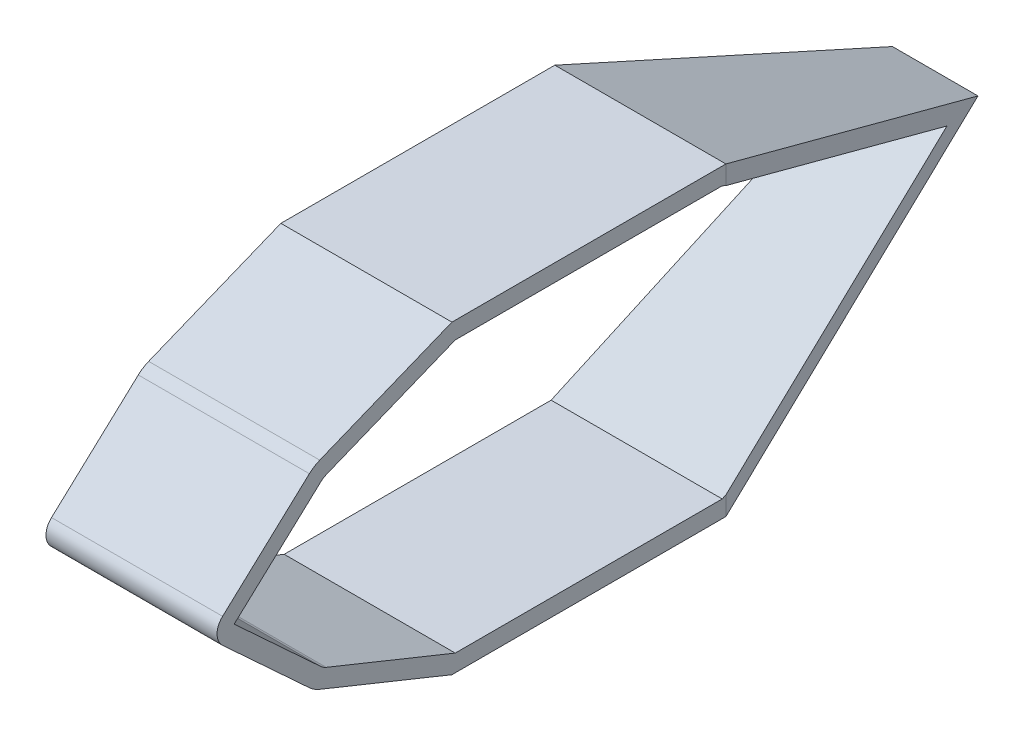
ISO-10303-21;
HEADER;
FILE_DESCRIPTION(('STEP AP214'),'2;1');
FILE_NAME('part.step','',(''),(''),'','','');
FILE_SCHEMA(('AUTOMOTIVE_DESIGN { 1 0 10303 214 1 1 1 1 }'));
ENDSEC;
DATA;
#1=APPLICATION_CONTEXT('core data for automotive mechanical design processes');
#2=APPLICATION_PROTOCOL_DEFINITION('international standard','automotive_design',2000,#1);
#3=PRODUCT_CONTEXT('',#1,'mechanical');
#4=PRODUCT('Part','Part','',(#3));
#5=PRODUCT_RELATED_PRODUCT_CATEGORY('part','',(#4));
#6=PRODUCT_DEFINITION_FORMATION('','',#4);
#7=PRODUCT_DEFINITION_CONTEXT('part definition',#1,'design');
#8=PRODUCT_DEFINITION('design','',#6,#7);
#9=PRODUCT_DEFINITION_SHAPE('','',#8);
#10=(LENGTH_UNIT() NAMED_UNIT(*) SI_UNIT(.MILLI.,.METRE.));
#11=(NAMED_UNIT(*) PLANE_ANGLE_UNIT() SI_UNIT($,.RADIAN.));
#12=(NAMED_UNIT(*) SI_UNIT($,.STERADIAN.) SOLID_ANGLE_UNIT());
#13=UNCERTAINTY_MEASURE_WITH_UNIT(LENGTH_MEASURE(1.E-05),#10,'distance_accuracy_value','');
#14=(GEOMETRIC_REPRESENTATION_CONTEXT(3) GLOBAL_UNCERTAINTY_ASSIGNED_CONTEXT((#13)) GLOBAL_UNIT_ASSIGNED_CONTEXT((#10,
#11,#12)) REPRESENTATION_CONTEXT('',''));
#15=CARTESIAN_POINT('',(0.,0.,0.));
#16=DIRECTION('',(0.,0.,1.));
#17=DIRECTION('',(1.,0.,0.));
#18=AXIS2_PLACEMENT_3D('',#15,#16,#17);
#19=CARTESIAN_POINT('',(0.,-19.7391785592261,74.9198203964593));
#20=DIRECTION('',(-1.,0.,0.));
#21=DIRECTION('',(0.,0.,1.));
#22=AXIS2_PLACEMENT_3D('',#19,#20,#21);
#23=PLANE('',#22);
#24=DIRECTION('',(0.,-0.37478188866065,-0.927113011413364));
#25=VECTOR('',#24,1.);
#26=CARTESIAN_POINT('',(0.,-44.6274996529894,40.0347666789892));
#27=LINE('',#26,#25);
#28=CARTESIAN_POINT('',(0.,-29.0103086733597,78.6676392830657));
#29=VERTEX_POINT('',#28);
#30=CARTESIAN_POINT('',(0.,-44.6274996529894,40.0347666789892));
#31=VERTEX_POINT('',#30);
#32=EDGE_CURVE('E275',#29,#31,#27,.T.);
#33=ORIENTED_EDGE('',*,*,#32,.F.);
#34=CARTESIAN_POINT('',(0.,-19.7391785592261,74.9198203964593));
#35=DIRECTION('',(1.,0.,0.));
#36=DIRECTION('',(0.,0.,1.));
#37=AXIS2_PLACEMENT_3D('',#34,#35,#36);
#38=CIRCLE('',#37,10.);
#39=CARTESIAN_POINT('',(0.,-27.0872588276389,81.7025717828041));
#40=VERTEX_POINT('',#39);
#41=EDGE_CURVE('E251',#40,#29,#38,.T.);
#42=ORIENTED_EDGE('',*,*,#41,.F.);
#43=DIRECTION('',(0.,-0.67827513863448,-0.734808026841281));
#44=VECTOR('',#43,1.);
#45=CARTESIAN_POINT('',(0.,-27.0872588276389,81.7025717828041));
#46=LINE('',#45,#44);
#47=CARTESIAN_POINT('',(0.,-3.67404013420349,107.067235840465));
#48=VERTEX_POINT('',#47);
#49=EDGE_CURVE('E254',#48,#40,#46,.T.);
#50=ORIENTED_EDGE('',*,*,#49,.F.);
#51=CARTESIAN_POINT('',(0.,2.94965179072665E-12,103.675860147292));
#52=DIRECTION('',(1.,0.,0.));
#53=DIRECTION('',(0.,0.,1.));
#54=AXIS2_PLACEMENT_3D('',#51,#52,#53);
#55=CIRCLE('',#54,5.);
#56=CARTESIAN_POINT('',(0.,3.67404013420982,107.067235840464));
#57=VERTEX_POINT('',#56);
#58=EDGE_CURVE('E260',#57,#48,#55,.T.);
#59=ORIENTED_EDGE('',*,*,#58,.F.);
#60=DIRECTION('',(0.,-0.678275138634384,0.73480802684137));
#61=VECTOR('',#60,1.);
#62=CARTESIAN_POINT('',(0.,27.087258827639,81.7025717828037));
#63=LINE('',#62,#61);
#64=CARTESIAN_POINT('',(0.,27.087258827639,81.7025717828037));
#65=VERTEX_POINT('',#64);
#66=EDGE_CURVE('E259',#65,#57,#63,.T.);
#67=ORIENTED_EDGE('',*,*,#66,.F.);
#68=CARTESIAN_POINT('',(0.,19.7391785592253,74.9198203964598));
#69=DIRECTION('',(1.,0.,0.));
#70=DIRECTION('',(0.,0.,1.));
#71=AXIS2_PLACEMENT_3D('',#68,#69,#70);
#72=CIRCLE('',#71,10.);
#73=CARTESIAN_POINT('',(0.,29.0103086733589,78.6676392830664));
#74=VERTEX_POINT('',#73);
#75=EDGE_CURVE('E261',#74,#65,#72,.T.);
#76=ORIENTED_EDGE('',*,*,#75,.F.);
#77=DIRECTION('',(0.,-0.374781888660659,0.92711301141336));
#78=VECTOR('',#77,1.);
#79=CARTESIAN_POINT('',(0.,44.6274996529891,40.0347666789897));
#80=LINE('',#79,#78);
#81=CARTESIAN_POINT('',(0.,44.6274996529891,40.0347666789897));
#82=VERTEX_POINT('',#81);
#83=EDGE_CURVE('E263',#82,#74,#80,.T.);
#84=ORIENTED_EDGE('',*,*,#83,.F.);
#85=DIRECTION('',(0.,0.,1.));
#86=VECTOR('',#85,1.);
#87=CARTESIAN_POINT('',(0.,44.6274996529891,-40.0347666789897));
#88=LINE('',#87,#86);
#89=CARTESIAN_POINT('',(0.,44.6274996529891,-40.0347666789897));
#90=VERTEX_POINT('',#89);
#91=EDGE_CURVE('E264',#90,#82,#88,.T.);
#92=ORIENTED_EDGE('',*,*,#91,.F.);
#93=DIRECTION('',(0.,0.412048239460073,0.911162031889968));
#94=VECTOR('',#93,1.);
#95=CARTESIAN_POINT('',(0.,44.6274996529891,-40.0347666789897));
#96=LINE('',#95,#94);
#97=CARTESIAN_POINT('',(0.,4.75842531189694E-13,-138.719530665043));
#98=VERTEX_POINT('',#97);
#99=EDGE_CURVE('E270',#98,#90,#96,.T.);
#100=ORIENTED_EDGE('',*,*,#99,.F.);
#101=DIRECTION('',(0.,0.412048239460081,-0.911162031889964));
#102=VECTOR('',#101,1.);
#103=CARTESIAN_POINT('',(0.,-44.6274996529894,-40.0347666789892));
#104=LINE('',#103,#102);
#105=CARTESIAN_POINT('',(0.,-44.6274996529894,-40.0347666789892));
#106=VERTEX_POINT('',#105);
#107=EDGE_CURVE('E267',#106,#98,#104,.T.);
#108=ORIENTED_EDGE('',*,*,#107,.F.);
#109=DIRECTION('',(0.,0.,-1.));
#110=VECTOR('',#109,1.);
#111=CARTESIAN_POINT('',(0.,-44.6274996529894,-40.0347666789892));
#112=LINE('',#111,#110);
#113=EDGE_CURVE('E221',#31,#106,#112,.T.);
#114=ORIENTED_EDGE('',*,*,#113,.F.);
#115=EDGE_LOOP('',(#33,#42,#50,#59,#67,#76,#84,#92,#100,#108,#114));
#116=FACE_BOUND('',#115,.T.);
#117=CARTESIAN_POINT('',(0.,-19.7391785592261,74.9198203964593));
#118=DIRECTION('',(-1.,0.,0.));
#119=DIRECTION('',(0.,0.,1.));
#120=AXIS2_PLACEMENT_3D('',#117,#118,#119);
#121=CIRCLE('',#120,5.);
#122=CARTESIAN_POINT('',(0.,-23.4132186934325,78.3111960896317));
#123=VERTEX_POINT('',#122);
#124=CARTESIAN_POINT('',(0.,-24.3747436162929,76.7937298397625));
#125=VERTEX_POINT('',#124);
#126=EDGE_CURVE('E309',#123,#125,#121,.F.);
#127=ORIENTED_EDGE('',*,*,#126,.T.);
#128=DIRECTION('',(0.,-0.37478188866065,-0.927113011413364));
#129=VECTOR('',#128,1.);
#130=CARTESIAN_POINT('',(0.,-24.3747436162929,76.7937298397625));
#131=LINE('',#130,#129);
#132=CARTESIAN_POINT('',(0.,-39.6274996529894,39.0623745918594));
#133=VERTEX_POINT('',#132);
#134=EDGE_CURVE('E209',#125,#133,#131,.T.);
#135=ORIENTED_EDGE('',*,*,#134,.T.);
#136=DIRECTION('',(0.,0.,-1.));
#137=VECTOR('',#136,1.);
#138=CARTESIAN_POINT('',(0.,-39.6274996529894,74.9198203964593));
#139=LINE('',#138,#137);
#140=CARTESIAN_POINT('',(0.,-39.6274996529894,-38.956762217346));
#141=VERTEX_POINT('',#140);
#142=EDGE_CURVE('E313',#133,#141,#139,.T.);
#143=ORIENTED_EDGE('',*,*,#142,.T.);
#144=DIRECTION('',(0.,0.412048239460081,-0.911162031889964));
#145=VECTOR('',#144,1.);
#146=CARTESIAN_POINT('',(0.,-79.0049187915131,48.1185017853678));
#147=LINE('',#146,#145);
#148=CARTESIAN_POINT('',(0.,4.23284633657849E-13,-126.585029116021));
#149=VERTEX_POINT('',#148);
#150=EDGE_CURVE('E314',#141,#149,#147,.T.);
#151=ORIENTED_EDGE('',*,*,#150,.T.);
#152=DIRECTION('',(0.,0.412048239460073,0.911162031889968));
#153=VECTOR('',#152,1.);
#154=CARTESIAN_POINT('',(0.,72.3021352112733,33.2966403589197));
#155=LINE('',#154,#153);
#156=CARTESIAN_POINT('',(0.,39.6274996529891,-38.9567622173465));
#157=VERTEX_POINT('',#156);
#158=EDGE_CURVE('E320',#149,#157,#155,.T.);
#159=ORIENTED_EDGE('',*,*,#158,.T.);
#160=DIRECTION('',(0.,0.,1.));
#161=VECTOR('',#160,1.);
#162=CARTESIAN_POINT('',(0.,39.6274996529891,74.9198203964593));
#163=LINE('',#162,#161);
#164=CARTESIAN_POINT('',(0.,39.6274996529891,39.0623745918598));
#165=VERTEX_POINT('',#164);
#166=EDGE_CURVE('E319',#157,#165,#163,.T.);
#167=ORIENTED_EDGE('',*,*,#166,.T.);
#168=DIRECTION('',(0.,-0.374781888660659,0.92711301141336));
#169=VECTOR('',#168,1.);
#170=CARTESIAN_POINT('',(0.,18.8295557764333,90.5110837264103));
#171=LINE('',#170,#169);
#172=CARTESIAN_POINT('',(0.,24.3747436162921,76.7937298397631));
#173=VERTEX_POINT('',#172);
#174=EDGE_CURVE('E323',#165,#173,#171,.T.);
#175=ORIENTED_EDGE('',*,*,#174,.T.);
#176=CARTESIAN_POINT('',(0.,19.7391785592253,74.9198203964598));
#177=DIRECTION('',(-1.,0.,0.));
#178=DIRECTION('',(0.,0.,1.));
#179=AXIS2_PLACEMENT_3D('',#176,#177,#178);
#180=CIRCLE('',#179,5.);
#181=CARTESIAN_POINT('',(0.,23.4132186934321,78.3111960896318));
#182=VERTEX_POINT('',#181);
#183=EDGE_CURVE('E326',#173,#182,#180,.F.);
#184=ORIENTED_EDGE('',*,*,#183,.T.);
#185=DIRECTION('',(0.,-0.678275138634384,0.73480802684137));
#186=VECTOR('',#185,1.);
#187=CARTESIAN_POINT('',(0.,5.25091769039682,97.9872888767114));
#188=LINE('',#187,#186);
#189=CARTESIAN_POINT('',(0.,2.9511542931211E-12,103.675860147292));
#190=VERTEX_POINT('',#189);
#191=EDGE_CURVE('E328',#182,#190,#188,.T.);
#192=ORIENTED_EDGE('',*,*,#191,.T.);
#193=DIRECTION('',(0.,-0.67827513863448,-0.734808026841281));
#194=VECTOR('',#193,1.);
#195=CARTESIAN_POINT('',(0.,-23.4132186934325,78.3111960896317));
#196=LINE('',#195,#194);
#197=EDGE_CURVE('E335',#190,#123,#196,.T.);
#198=ORIENTED_EDGE('',*,*,#197,.T.);
#199=EDGE_LOOP('',(#127,#135,#143,#151,#159,#167,#175,#184,#192,#198));
#200=FACE_BOUND('',#199,.T.);
#201=ADVANCED_FACE('F43',(#116,#200),#23,.T.);
#202=CARTESIAN_POINT('',(50.,-44.6274996529894,40.0347666789892));
#203=DIRECTION('',(0.,0.927113011413364,-0.37478188866065));
#204=DIRECTION('',(0.,0.37478188866065,0.927113011413364));
#205=AXIS2_PLACEMENT_3D('',#202,#203,#204);
#206=PLANE('',#205);
#207=ORIENTED_EDGE('',*,*,#32,.T.);
#208=DIRECTION('',(-1.,0.,0.));
#209=VECTOR('',#208,1.);
#210=CARTESIAN_POINT('',(50.,-44.6274996529894,40.0347666789892));
#211=LINE('',#210,#209);
#212=CARTESIAN_POINT('',(50.,-44.6274996529894,40.0347666789892));
#213=VERTEX_POINT('',#212);
#214=EDGE_CURVE('E51',#213,#31,#211,.T.);
#215=ORIENTED_EDGE('',*,*,#214,.F.);
#216=DIRECTION('',(0.,-0.37478188866065,-0.927113011413364));
#217=VECTOR('',#216,1.);
#218=CARTESIAN_POINT('',(50.,-44.6274996529894,40.0347666789892));
#219=LINE('',#218,#217);
#220=CARTESIAN_POINT('',(50.,-29.0103086733597,78.6676392830657));
#221=VERTEX_POINT('',#220);
#222=EDGE_CURVE('E220',#221,#213,#219,.T.);
#223=ORIENTED_EDGE('',*,*,#222,.F.);
#224=DIRECTION('',(-1.,0.,0.));
#225=VECTOR('',#224,1.);
#226=CARTESIAN_POINT('',(50.,-29.0103086733597,78.6676392830657));
#227=LINE('',#226,#225);
#228=EDGE_CURVE('E248',#221,#29,#227,.T.);
#229=ORIENTED_EDGE('',*,*,#228,.T.);
#230=EDGE_LOOP('',(#207,#215,#223,#229));
#231=FACE_BOUND('',#230,.T.);
#232=ADVANCED_FACE('F44',(#231),#206,.F.);
#233=CARTESIAN_POINT('',(50.,-44.6274996529894,-40.0347666789892));
#234=DIRECTION('',(0.,1.,0.));
#235=DIRECTION('',(0.,0.,1.));
#236=AXIS2_PLACEMENT_3D('',#233,#234,#235);
#237=PLANE('',#236);
#238=ORIENTED_EDGE('',*,*,#113,.T.);
#239=DIRECTION('',(-1.,0.,0.));
#240=VECTOR('',#239,1.);
#241=CARTESIAN_POINT('',(50.,-44.6274996529894,-40.0347666789892));
#242=LINE('',#241,#240);
#243=CARTESIAN_POINT('',(50.,-44.6274996529894,-40.0347666789897));
#244=VERTEX_POINT('',#243);
#245=EDGE_CURVE('E210',#244,#106,#242,.T.);
#246=ORIENTED_EDGE('',*,*,#245,.F.);
#247=DIRECTION('',(0.,0.,-1.));
#248=VECTOR('',#247,1.);
#249=CARTESIAN_POINT('',(50.,-44.6274996529894,-40.0347666789892));
#250=LINE('',#249,#248);
#251=EDGE_CURVE('E212',#213,#244,#250,.T.);
#252=ORIENTED_EDGE('',*,*,#251,.F.);
#253=ORIENTED_EDGE('',*,*,#214,.T.);
#254=EDGE_LOOP('',(#238,#246,#252,#253));
#255=FACE_BOUND('',#254,.T.);
#256=ADVANCED_FACE('F224',(#255),#237,.F.);
#257=CARTESIAN_POINT('',(50.,-44.6274996529894,-40.0347666789892));
#258=DIRECTION('',(0.,0.911162031889964,0.412048239460081));
#259=DIRECTION('',(0.,-0.412048239460081,0.911162031889964));
#260=AXIS2_PLACEMENT_3D('',#257,#258,#259);
#261=PLANE('',#260);
#262=DIRECTION('',(-1.,0.,0.));
#263=VECTOR('',#262,1.);
#264=CARTESIAN_POINT('',(50.,4.75842531189694E-13,-138.719530665043));
#265=LINE('',#264,#263);
#266=CARTESIAN_POINT('',(25.,4.85722573273506E-13,-138.719530665043));
#267=VERTEX_POINT('',#266);
#268=EDGE_CURVE('E207',#267,#98,#265,.T.);
#269=ORIENTED_EDGE('',*,*,#268,.F.);
#270=DIRECTION('',(0.224912413013984,-0.401491145349386,0.887817135832748));
#271=VECTOR('',#270,1.);
#272=CARTESIAN_POINT('',(50.0000000000001,-44.6274996529894,-40.0347666789892));
#273=LINE('',#272,#271);
#274=EDGE_CURVE('E191',#267,#244,#273,.T.);
#275=ORIENTED_EDGE('',*,*,#274,.T.);
#276=ORIENTED_EDGE('',*,*,#245,.T.);
#277=ORIENTED_EDGE('',*,*,#107,.T.);
#278=EDGE_LOOP('',(#269,#275,#276,#277));
#279=FACE_BOUND('',#278,.T.);
#280=ADVANCED_FACE('F204',(#279),#261,.F.);
#281=CARTESIAN_POINT('',(50.,44.6274996529891,-40.0347666789897));
#282=DIRECTION('',(0.,-0.911162031889968,0.412048239460073));
#283=DIRECTION('',(0.,-0.412048239460073,-0.911162031889968));
#284=AXIS2_PLACEMENT_3D('',#281,#282,#283);
#285=PLANE('',#284);
#286=DIRECTION('',(-1.,0.,0.));
#287=VECTOR('',#286,1.);
#288=CARTESIAN_POINT('',(50.,44.6274996529891,-40.0347666789897));
#289=LINE('',#288,#287);
#290=CARTESIAN_POINT('',(50.,44.6274996529891,-40.0347666789897));
#291=VERTEX_POINT('',#290);
#292=EDGE_CURVE('E226',#291,#90,#289,.T.);
#293=ORIENTED_EDGE('',*,*,#292,.F.);
#294=DIRECTION('',(-0.224912413013985,-0.401491145349378,-0.887817135832752));
#295=VECTOR('',#294,1.);
#296=CARTESIAN_POINT('',(50.,44.6274996529891,-40.0347666789897));
#297=LINE('',#296,#295);
#298=EDGE_CURVE('E211',#291,#267,#297,.T.);
#299=ORIENTED_EDGE('',*,*,#298,.T.);
#300=ORIENTED_EDGE('',*,*,#268,.T.);
#301=ORIENTED_EDGE('',*,*,#99,.T.);
#302=EDGE_LOOP('',(#293,#299,#300,#301));
#303=FACE_BOUND('',#302,.T.);
#304=ADVANCED_FACE('F362',(#303),#285,.F.);
#305=CARTESIAN_POINT('',(50.,44.6274996529891,-40.0347666789897));
#306=DIRECTION('',(0.,-1.,0.));
#307=DIRECTION('',(0.,0.,-1.));
#308=AXIS2_PLACEMENT_3D('',#305,#306,#307);
#309=PLANE('',#308);
#310=ORIENTED_EDGE('',*,*,#91,.T.);
#311=DIRECTION('',(-1.,0.,0.));
#312=VECTOR('',#311,1.);
#313=CARTESIAN_POINT('',(50.,44.6274996529891,40.0347666789897));
#314=LINE('',#313,#312);
#315=CARTESIAN_POINT('',(50.,44.6274996529891,40.0347666789897));
#316=VERTEX_POINT('',#315);
#317=EDGE_CURVE('E234',#316,#82,#314,.T.);
#318=ORIENTED_EDGE('',*,*,#317,.F.);
#319=DIRECTION('',(0.,0.,1.));
#320=VECTOR('',#319,1.);
#321=CARTESIAN_POINT('',(50.,44.6274996529891,-40.0347666789897));
#322=LINE('',#321,#320);
#323=EDGE_CURVE('E222',#291,#316,#322,.T.);
#324=ORIENTED_EDGE('',*,*,#323,.F.);
#325=ORIENTED_EDGE('',*,*,#292,.T.);
#326=EDGE_LOOP('',(#310,#318,#324,#325));
#327=FACE_BOUND('',#326,.T.);
#328=ADVANCED_FACE('F451',(#327),#309,.F.);
#329=CARTESIAN_POINT('',(50.,44.6274996529891,40.0347666789897));
#330=DIRECTION('',(0.,-0.92711301141336,-0.374781888660659));
#331=DIRECTION('',(0.,0.374781888660659,-0.92711301141336));
#332=AXIS2_PLACEMENT_3D('',#329,#330,#331);
#333=PLANE('',#332);
#334=ORIENTED_EDGE('',*,*,#83,.T.);
#335=DIRECTION('',(-1.,0.,0.));
#336=VECTOR('',#335,1.);
#337=CARTESIAN_POINT('',(50.,29.0103086733589,78.6676392830664));
#338=LINE('',#337,#336);
#339=CARTESIAN_POINT('',(50.,29.0103086733589,78.6676392830664));
#340=VERTEX_POINT('',#339);
#341=EDGE_CURVE('E233',#340,#74,#338,.T.);
#342=ORIENTED_EDGE('',*,*,#341,.F.);
#343=DIRECTION('',(0.,-0.374781888660659,0.92711301141336));
#344=VECTOR('',#343,1.);
#345=CARTESIAN_POINT('',(50.,44.6274996529891,40.0347666789897));
#346=LINE('',#345,#344);
#347=EDGE_CURVE('E285',#316,#340,#346,.T.);
#348=ORIENTED_EDGE('',*,*,#347,.F.);
#349=ORIENTED_EDGE('',*,*,#317,.T.);
#350=EDGE_LOOP('',(#334,#342,#348,#349));
#351=FACE_BOUND('',#350,.T.);
#352=ADVANCED_FACE('F449',(#351),#333,.F.);
#353=CARTESIAN_POINT('',(50.,19.7391785592253,74.9198203964598));
#354=DIRECTION('',(-1.,0.,0.));
#355=DIRECTION('',(0.,0.,1.));
#356=AXIS2_PLACEMENT_3D('',#353,#354,#355);
#357=CYLINDRICAL_SURFACE('',#356,10.);
#358=ORIENTED_EDGE('',*,*,#75,.T.);
#359=DIRECTION('',(-1.,0.,0.));
#360=VECTOR('',#359,1.);
#361=CARTESIAN_POINT('',(50.,27.087258827639,81.7025717828037));
#362=LINE('',#361,#360);
#363=CARTESIAN_POINT('',(50.,27.087258827639,81.7025717828037));
#364=VERTEX_POINT('',#363);
#365=EDGE_CURVE('E240',#364,#65,#362,.T.);
#366=ORIENTED_EDGE('',*,*,#365,.F.);
#367=CARTESIAN_POINT('',(50.,19.7391785592253,74.9198203964598));
#368=DIRECTION('',(1.,0.,0.));
#369=DIRECTION('',(0.,0.,1.));
#370=AXIS2_PLACEMENT_3D('',#367,#368,#369);
#371=CIRCLE('',#370,10.);
#372=EDGE_CURVE('E284',#340,#364,#371,.T.);
#373=ORIENTED_EDGE('',*,*,#372,.F.);
#374=ORIENTED_EDGE('',*,*,#341,.T.);
#375=EDGE_LOOP('',(#358,#366,#373,#374));
#376=FACE_BOUND('',#375,.T.);
#377=ADVANCED_FACE('F441',(#376),#357,.T.);
#378=CARTESIAN_POINT('',(50.,27.087258827639,81.7025717828037));
#379=DIRECTION('',(0.,-0.73480802684137,-0.678275138634384));
#380=DIRECTION('',(0.,0.678275138634384,-0.73480802684137));
#381=AXIS2_PLACEMENT_3D('',#378,#379,#380);
#382=PLANE('',#381);
#383=ORIENTED_EDGE('',*,*,#66,.T.);
#384=DIRECTION('',(-1.,0.,0.));
#385=VECTOR('',#384,1.);
#386=CARTESIAN_POINT('',(50.,3.67404013420982,107.067235840464));
#387=LINE('',#386,#385);
#388=CARTESIAN_POINT('',(50.,3.67404013420982,107.067235840464));
#389=VERTEX_POINT('',#388);
#390=EDGE_CURVE('E238',#389,#57,#387,.T.);
#391=ORIENTED_EDGE('',*,*,#390,.F.);
#392=DIRECTION('',(0.,-0.678275138634384,0.73480802684137));
#393=VECTOR('',#392,1.);
#394=CARTESIAN_POINT('',(50.,27.087258827639,81.7025717828037));
#395=LINE('',#394,#393);
#396=EDGE_CURVE('E281',#364,#389,#395,.T.);
#397=ORIENTED_EDGE('',*,*,#396,.F.);
#398=ORIENTED_EDGE('',*,*,#365,.T.);
#399=EDGE_LOOP('',(#383,#391,#397,#398));
#400=FACE_BOUND('',#399,.T.);
#401=ADVANCED_FACE('F439',(#400),#382,.F.);
#402=CARTESIAN_POINT('',(50.,2.94965179072665E-12,103.675860147292));
#403=DIRECTION('',(-1.,0.,0.));
#404=DIRECTION('',(0.,0.,1.));
#405=AXIS2_PLACEMENT_3D('',#402,#403,#404);
#406=CYLINDRICAL_SURFACE('',#405,5.);
#407=ORIENTED_EDGE('',*,*,#58,.T.);
#408=DIRECTION('',(-1.,0.,0.));
#409=VECTOR('',#408,1.);
#410=CARTESIAN_POINT('',(50.,-3.67404013420349,107.067235840465));
#411=LINE('',#410,#409);
#412=CARTESIAN_POINT('',(50.,-3.67404013420349,107.067235840465));
#413=VERTEX_POINT('',#412);
#414=EDGE_CURVE('E244',#413,#48,#411,.T.);
#415=ORIENTED_EDGE('',*,*,#414,.F.);
#416=CARTESIAN_POINT('',(50.,2.94965179072665E-12,103.675860147292));
#417=DIRECTION('',(1.,0.,0.));
#418=DIRECTION('',(0.,0.,1.));
#419=AXIS2_PLACEMENT_3D('',#416,#417,#418);
#420=CIRCLE('',#419,5.);
#421=EDGE_CURVE('E276',#389,#413,#420,.T.);
#422=ORIENTED_EDGE('',*,*,#421,.F.);
#423=ORIENTED_EDGE('',*,*,#390,.T.);
#424=EDGE_LOOP('',(#407,#415,#422,#423));
#425=FACE_BOUND('',#424,.T.);
#426=ADVANCED_FACE('F436',(#425),#406,.T.);
#427=CARTESIAN_POINT('',(50.,-27.0872588276389,81.7025717828041));
#428=DIRECTION('',(0.,0.734808026841281,-0.67827513863448));
#429=DIRECTION('',(0.,0.67827513863448,0.734808026841281));
#430=AXIS2_PLACEMENT_3D('',#427,#428,#429);
#431=PLANE('',#430);
#432=ORIENTED_EDGE('',*,*,#49,.T.);
#433=DIRECTION('',(-1.,0.,0.));
#434=VECTOR('',#433,1.);
#435=CARTESIAN_POINT('',(50.,-27.0872588276389,81.7025717828041));
#436=LINE('',#435,#434);
#437=CARTESIAN_POINT('',(50.,-27.0872588276389,81.7025717828041));
#438=VERTEX_POINT('',#437);
#439=EDGE_CURVE('E249',#438,#40,#436,.T.);
#440=ORIENTED_EDGE('',*,*,#439,.F.);
#441=DIRECTION('',(0.,-0.67827513863448,-0.734808026841281));
#442=VECTOR('',#441,1.);
#443=CARTESIAN_POINT('',(50.,-27.0872588276389,81.7025717828041));
#444=LINE('',#443,#442);
#445=EDGE_CURVE('E280',#413,#438,#444,.T.);
#446=ORIENTED_EDGE('',*,*,#445,.F.);
#447=ORIENTED_EDGE('',*,*,#414,.T.);
#448=EDGE_LOOP('',(#432,#440,#446,#447));
#449=FACE_BOUND('',#448,.T.);
#450=ADVANCED_FACE('F435',(#449),#431,.F.);
#451=CARTESIAN_POINT('',(50.,-19.7391785592261,74.9198203964593));
#452=DIRECTION('',(-1.,0.,0.));
#453=DIRECTION('',(0.,0.,1.));
#454=AXIS2_PLACEMENT_3D('',#451,#452,#453);
#455=CYLINDRICAL_SURFACE('',#454,10.);
#456=ORIENTED_EDGE('',*,*,#41,.T.);
#457=ORIENTED_EDGE('',*,*,#228,.F.);
#458=CARTESIAN_POINT('',(50.,-19.7391785592261,74.9198203964593));
#459=DIRECTION('',(1.,0.,0.));
#460=DIRECTION('',(0.,0.,1.));
#461=AXIS2_PLACEMENT_3D('',#458,#459,#460);
#462=CIRCLE('',#461,10.);
#463=EDGE_CURVE('E252',#438,#221,#462,.T.);
#464=ORIENTED_EDGE('',*,*,#463,.F.);
#465=ORIENTED_EDGE('',*,*,#439,.T.);
#466=EDGE_LOOP('',(#456,#457,#464,#465));
#467=FACE_BOUND('',#466,.T.);
#468=ADVANCED_FACE('F429',(#467),#455,.T.);
#469=CARTESIAN_POINT('',(50.,-19.7391785592261,74.9198203964593));
#470=DIRECTION('',(-1.,0.,0.));
#471=DIRECTION('',(0.,0.,1.));
#472=AXIS2_PLACEMENT_3D('',#469,#470,#471);
#473=PLANE('',#472);
#474=ORIENTED_EDGE('',*,*,#251,.T.);
#475=DIRECTION('',(0.,1.,0.));
#476=VECTOR('',#475,1.);
#477=CARTESIAN_POINT('',(50.,-44.6274996529894,-40.0347666789897));
#478=LINE('',#477,#476);
#479=CARTESIAN_POINT('',(50.,-39.1400014638594,-40.0347666789897));
#480=VERTEX_POINT('',#479);
#481=EDGE_CURVE('E188',#244,#480,#478,.T.);
#482=ORIENTED_EDGE('',*,*,#481,.T.);
#483=DIRECTION('',(0.,0.412048239460081,-0.911162031889964));
#484=VECTOR('',#483,1.);
#485=CARTESIAN_POINT('',(50.,-79.0049187915131,48.1185017853678));
#486=LINE('',#485,#484);
#487=CARTESIAN_POINT('',(50.,-39.6274996529894,-38.956762217346));
#488=VERTEX_POINT('',#487);
#489=EDGE_CURVE('E303',#488,#480,#486,.T.);
#490=ORIENTED_EDGE('',*,*,#489,.F.);
#491=DIRECTION('',(0.,0.,-1.));
#492=VECTOR('',#491,1.);
#493=CARTESIAN_POINT('',(50.,-39.6274996529894,74.9198203964593));
#494=LINE('',#493,#492);
#495=CARTESIAN_POINT('',(50.,-39.6274996529894,39.0623745918594));
#496=VERTEX_POINT('',#495);
#497=EDGE_CURVE('E308',#496,#488,#494,.T.);
#498=ORIENTED_EDGE('',*,*,#497,.F.);
#499=DIRECTION('',(0.,-0.37478188866065,-0.927113011413364));
#500=VECTOR('',#499,1.);
#501=CARTESIAN_POINT('',(50.,-24.3747436162929,76.7937298397625));
#502=LINE('',#501,#500);
#503=CARTESIAN_POINT('',(50.,-24.3747436162929,76.7937298397625));
#504=VERTEX_POINT('',#503);
#505=EDGE_CURVE('E306',#504,#496,#502,.T.);
#506=ORIENTED_EDGE('',*,*,#505,.F.);
#507=CARTESIAN_POINT('',(50.,-19.7391785592261,74.9198203964593));
#508=DIRECTION('',(-1.,0.,0.));
#509=DIRECTION('',(0.,0.,1.));
#510=AXIS2_PLACEMENT_3D('',#507,#508,#509);
#511=CIRCLE('',#510,5.);
#512=CARTESIAN_POINT('',(50.,-23.4132186934325,78.3111960896317));
#513=VERTEX_POINT('',#512);
#514=EDGE_CURVE('E288',#513,#504,#511,.F.);
#515=ORIENTED_EDGE('',*,*,#514,.F.);
#516=DIRECTION('',(0.,-0.67827513863448,-0.734808026841281));
#517=VECTOR('',#516,1.);
#518=CARTESIAN_POINT('',(50.,-23.4132186934325,78.3111960896317));
#519=LINE('',#518,#517);
#520=CARTESIAN_POINT('',(50.,2.9511542931211E-12,103.675860147292));
#521=VERTEX_POINT('',#520);
#522=EDGE_CURVE('E295',#521,#513,#519,.T.);
#523=ORIENTED_EDGE('',*,*,#522,.F.);
#524=DIRECTION('',(0.,-0.678275138634384,0.73480802684137));
#525=VECTOR('',#524,1.);
#526=CARTESIAN_POINT('',(50.,5.25091769039682,97.9872888767114));
#527=LINE('',#526,#525);
#528=CARTESIAN_POINT('',(50.,23.4132186934321,78.3111960896318));
#529=VERTEX_POINT('',#528);
#530=EDGE_CURVE('E294',#529,#521,#527,.T.);
#531=ORIENTED_EDGE('',*,*,#530,.F.);
#532=CARTESIAN_POINT('',(50.,19.7391785592253,74.9198203964598));
#533=DIRECTION('',(-1.,0.,0.));
#534=DIRECTION('',(0.,0.,1.));
#535=AXIS2_PLACEMENT_3D('',#532,#533,#534);
#536=CIRCLE('',#535,5.);
#537=CARTESIAN_POINT('',(50.,24.3747436162921,76.7937298397631));
#538=VERTEX_POINT('',#537);
#539=EDGE_CURVE('E296',#538,#529,#536,.F.);
#540=ORIENTED_EDGE('',*,*,#539,.F.);
#541=DIRECTION('',(0.,-0.374781888660659,0.92711301141336));
#542=VECTOR('',#541,1.);
#543=CARTESIAN_POINT('',(50.,18.8295557764333,90.5110837264103));
#544=LINE('',#543,#542);
#545=CARTESIAN_POINT('',(50.,39.6274996529891,39.0623745918598));
#546=VERTEX_POINT('',#545);
#547=EDGE_CURVE('E299',#546,#538,#544,.T.);
#548=ORIENTED_EDGE('',*,*,#547,.F.);
#549=DIRECTION('',(0.,0.,1.));
#550=VECTOR('',#549,1.);
#551=CARTESIAN_POINT('',(50.,39.6274996529891,74.9198203964593));
#552=LINE('',#551,#550);
#553=CARTESIAN_POINT('',(50.,39.6274996529891,-38.9567622173465));
#554=VERTEX_POINT('',#553);
#555=EDGE_CURVE('E300',#554,#546,#552,.T.);
#556=ORIENTED_EDGE('',*,*,#555,.F.);
#557=DIRECTION('',(0.,0.412048239460073,0.911162031889968));
#558=VECTOR('',#557,1.);
#559=CARTESIAN_POINT('',(50.,72.3021352112733,33.2966403589197));
#560=LINE('',#559,#558);
#561=CARTESIAN_POINT('',(50.,39.1400014638594,-40.0347666789895));
#562=VERTEX_POINT('',#561);
#563=EDGE_CURVE('E301',#562,#554,#560,.T.);
#564=ORIENTED_EDGE('',*,*,#563,.F.);
#565=EDGE_CURVE('E60',#562,#291,#478,.T.);
#566=ORIENTED_EDGE('',*,*,#565,.T.);
#567=ORIENTED_EDGE('',*,*,#323,.T.);
#568=ORIENTED_EDGE('',*,*,#347,.T.);
#569=ORIENTED_EDGE('',*,*,#372,.T.);
#570=ORIENTED_EDGE('',*,*,#396,.T.);
#571=ORIENTED_EDGE('',*,*,#421,.T.);
#572=ORIENTED_EDGE('',*,*,#445,.T.);
#573=ORIENTED_EDGE('',*,*,#463,.T.);
#574=ORIENTED_EDGE('',*,*,#222,.T.);
#575=EDGE_LOOP('',(#474,#482,#490,#498,#506,#515,#523,#531,#540,#548,#556,#564,#566,#567,#568,
#569,#570,#571,#572,#573,#574));
#576=FACE_BOUND('',#575,.T.);
#577=ADVANCED_FACE('F214',(#576),#473,.F.);
#578=CARTESIAN_POINT('',(50.,-39.9919345959226,38.160857235686));
#579=DIRECTION('',(0.,0.927113011413364,-0.37478188866065));
#580=DIRECTION('',(0.,0.37478188866065,0.927113011413364));
#581=AXIS2_PLACEMENT_3D('',#578,#579,#580);
#582=PLANE('',#581);
#583=ORIENTED_EDGE('',*,*,#134,.F.);
#584=DIRECTION('',(1.,0.,0.));
#585=VECTOR('',#584,1.);
#586=CARTESIAN_POINT('',(50.,-24.3747436162929,76.7937298397625));
#587=LINE('',#586,#585);
#588=EDGE_CURVE('E292',#504,#125,#587,.F.);
#589=ORIENTED_EDGE('',*,*,#588,.F.);
#590=ORIENTED_EDGE('',*,*,#505,.T.);
#591=DIRECTION('',(-1.,0.,0.));
#592=VECTOR('',#591,1.);
#593=CARTESIAN_POINT('',(50.,-39.6274996529894,39.0623745918594));
#594=LINE('',#593,#592);
#595=EDGE_CURVE('E274',#496,#133,#594,.T.);
#596=ORIENTED_EDGE('',*,*,#595,.T.);
#597=EDGE_LOOP('',(#583,#589,#590,#596));
#598=FACE_BOUND('',#597,.T.);
#599=ADVANCED_FACE('F388',(#598),#582,.T.);
#600=CARTESIAN_POINT('',(50.,-39.6274996529894,-40.0347666789892));
#601=DIRECTION('',(0.,1.,0.));
#602=DIRECTION('',(0.,0.,1.));
#603=AXIS2_PLACEMENT_3D('',#600,#601,#602);
#604=PLANE('',#603);
#605=ORIENTED_EDGE('',*,*,#142,.F.);
#606=ORIENTED_EDGE('',*,*,#595,.F.);
#607=ORIENTED_EDGE('',*,*,#497,.T.);
#608=DIRECTION('',(-1.,0.,0.));
#609=VECTOR('',#608,1.);
#610=CARTESIAN_POINT('',(50.,-39.6274996529894,-38.956762217346));
#611=LINE('',#610,#609);
#612=EDGE_CURVE('E354',#488,#141,#611,.T.);
#613=ORIENTED_EDGE('',*,*,#612,.T.);
#614=EDGE_LOOP('',(#605,#606,#607,#613));
#615=FACE_BOUND('',#614,.T.);
#616=ADVANCED_FACE('F390',(#615),#604,.T.);
#617=CARTESIAN_POINT('',(50.,-40.0716894935396,-37.9745254816888));
#618=DIRECTION('',(0.,0.911162031889964,0.412048239460081));
#619=DIRECTION('',(0.,-0.412048239460081,0.911162031889964));
#620=AXIS2_PLACEMENT_3D('',#617,#618,#619);
#621=PLANE('',#620);
#622=DIRECTION('',(0.224912413013984,-0.401491145349386,0.887817135832748));
#623=VECTOR('',#622,1.);
#624=CARTESIAN_POINT('',(50.4955229648726,-40.0245595015755,-38.0787440054646));
#625=LINE('',#624,#623);
#626=CARTESIAN_POINT('',(28.0740564852384,4.23272528138341E-13,-126.585029116021));
#627=VERTEX_POINT('',#626);
#628=EDGE_CURVE('E192',#627,#480,#625,.T.);
#629=ORIENTED_EDGE('',*,*,#628,.F.);
#630=DIRECTION('',(-1.,0.,0.));
#631=VECTOR('',#630,1.);
#632=CARTESIAN_POINT('',(50.,4.23272528138341E-13,-126.585029116021));
#633=LINE('',#632,#631);
#634=EDGE_CURVE('E351',#627,#149,#633,.T.);
#635=ORIENTED_EDGE('',*,*,#634,.T.);
#636=ORIENTED_EDGE('',*,*,#150,.F.);
#637=ORIENTED_EDGE('',*,*,#612,.F.);
#638=ORIENTED_EDGE('',*,*,#489,.T.);
#639=EDGE_LOOP('',(#629,#635,#636,#637,#638));
#640=FACE_BOUND('',#639,.T.);
#641=ADVANCED_FACE('F379',(#640),#621,.T.);
#642=CARTESIAN_POINT('',(50.,40.0716894935393,-37.9745254816893));
#643=DIRECTION('',(0.,-0.911162031889968,0.412048239460073));
#644=DIRECTION('',(0.,-0.412048239460073,-0.911162031889968));
#645=AXIS2_PLACEMENT_3D('',#642,#643,#644);
#646=PLANE('',#645);
#647=DIRECTION('',(-0.224912413013985,-0.401491145349378,-0.887817135832752));
#648=VECTOR('',#647,1.);
#649=CARTESIAN_POINT('',(50.4955229648725,40.0245595015752,-38.0787440054651));
#650=LINE('',#649,#648);
#651=EDGE_CURVE('E11',#562,#627,#650,.T.);
#652=ORIENTED_EDGE('',*,*,#651,.F.);
#653=ORIENTED_EDGE('',*,*,#563,.T.);
#654=DIRECTION('',(-1.,0.,0.));
#655=VECTOR('',#654,1.);
#656=CARTESIAN_POINT('',(50.,39.6274996529891,-38.9567622173465));
#657=LINE('',#656,#655);
#658=EDGE_CURVE('E349',#554,#157,#657,.T.);
#659=ORIENTED_EDGE('',*,*,#658,.T.);
#660=ORIENTED_EDGE('',*,*,#158,.F.);
#661=ORIENTED_EDGE('',*,*,#634,.F.);
#662=EDGE_LOOP('',(#652,#653,#659,#660,#661));
#663=FACE_BOUND('',#662,.T.);
#664=ADVANCED_FACE('F367',(#663),#646,.T.);
#665=CARTESIAN_POINT('',(50.,39.6274996529891,-40.0347666789897));
#666=DIRECTION('',(0.,-1.,0.));
#667=DIRECTION('',(0.,0.,-1.));
#668=AXIS2_PLACEMENT_3D('',#665,#666,#667);
#669=PLANE('',#668);
#670=ORIENTED_EDGE('',*,*,#166,.F.);
#671=ORIENTED_EDGE('',*,*,#658,.F.);
#672=ORIENTED_EDGE('',*,*,#555,.T.);
#673=DIRECTION('',(-1.,0.,0.));
#674=VECTOR('',#673,1.);
#675=CARTESIAN_POINT('',(50.,39.6274996529891,39.0623745918598));
#676=LINE('',#675,#674);
#677=EDGE_CURVE('E350',#546,#165,#676,.T.);
#678=ORIENTED_EDGE('',*,*,#677,.T.);
#679=EDGE_LOOP('',(#670,#671,#672,#678));
#680=FACE_BOUND('',#679,.T.);
#681=ADVANCED_FACE('F374',(#680),#669,.T.);
#682=CARTESIAN_POINT('',(50.,39.9919345959223,38.1608572356864));
#683=DIRECTION('',(0.,-0.92711301141336,-0.374781888660659));
#684=DIRECTION('',(0.,0.374781888660659,-0.92711301141336));
#685=AXIS2_PLACEMENT_3D('',#682,#683,#684);
#686=PLANE('',#685);
#687=ORIENTED_EDGE('',*,*,#174,.F.);
#688=ORIENTED_EDGE('',*,*,#677,.F.);
#689=ORIENTED_EDGE('',*,*,#547,.T.);
#690=DIRECTION('',(-1.,0.,0.));
#691=VECTOR('',#690,1.);
#692=CARTESIAN_POINT('',(50.,24.3747436162921,76.7937298397631));
#693=LINE('',#692,#691);
#694=EDGE_CURVE('E342',#538,#173,#693,.T.);
#695=ORIENTED_EDGE('',*,*,#694,.T.);
#696=EDGE_LOOP('',(#687,#688,#689,#695));
#697=FACE_BOUND('',#696,.T.);
#698=ADVANCED_FACE('F409',(#697),#686,.T.);
#699=CARTESIAN_POINT('',(50.,19.7391785592253,74.9198203964598));
#700=DIRECTION('',(-1.,0.,0.));
#701=DIRECTION('',(0.,0.,1.));
#702=AXIS2_PLACEMENT_3D('',#699,#700,#701);
#703=CYLINDRICAL_SURFACE('',#702,5.);
#704=ORIENTED_EDGE('',*,*,#183,.F.);
#705=ORIENTED_EDGE('',*,*,#694,.F.);
#706=ORIENTED_EDGE('',*,*,#539,.T.);
#707=DIRECTION('',(1.,0.,0.));
#708=VECTOR('',#707,1.);
#709=CARTESIAN_POINT('',(50.,23.4132186934321,78.3111960896318));
#710=LINE('',#709,#708);
#711=EDGE_CURVE('E345',#529,#182,#710,.F.);
#712=ORIENTED_EDGE('',*,*,#711,.T.);
#713=EDGE_LOOP('',(#704,#705,#706,#712));
#714=FACE_BOUND('',#713,.T.);
#715=ADVANCED_FACE('F406',(#714),#703,.F.);
#716=CARTESIAN_POINT('',(50.,23.4132186934321,78.3111960896318));
#717=DIRECTION('',(0.,-0.73480802684137,-0.678275138634384));
#718=DIRECTION('',(0.,0.678275138634384,-0.73480802684137));
#719=AXIS2_PLACEMENT_3D('',#716,#717,#718);
#720=PLANE('',#719);
#721=ORIENTED_EDGE('',*,*,#191,.F.);
#722=ORIENTED_EDGE('',*,*,#711,.F.);
#723=ORIENTED_EDGE('',*,*,#530,.T.);
#724=DIRECTION('',(-1.,0.,0.));
#725=VECTOR('',#724,1.);
#726=CARTESIAN_POINT('',(50.,2.94902990916057E-12,103.675860147292));
#727=LINE('',#726,#725);
#728=EDGE_CURVE('E340',#521,#190,#727,.T.);
#729=ORIENTED_EDGE('',*,*,#728,.T.);
#730=EDGE_LOOP('',(#721,#722,#723,#729));
#731=FACE_BOUND('',#730,.T.);
#732=ADVANCED_FACE('F402',(#731),#720,.T.);
#733=CARTESIAN_POINT('',(50.,-23.4132186934325,78.3111960896317));
#734=DIRECTION('',(0.,0.734808026841281,-0.67827513863448));
#735=DIRECTION('',(0.,0.67827513863448,0.734808026841281));
#736=AXIS2_PLACEMENT_3D('',#733,#734,#735);
#737=PLANE('',#736);
#738=ORIENTED_EDGE('',*,*,#197,.F.);
#739=ORIENTED_EDGE('',*,*,#728,.F.);
#740=ORIENTED_EDGE('',*,*,#522,.T.);
#741=DIRECTION('',(-1.,0.,0.));
#742=VECTOR('',#741,1.);
#743=CARTESIAN_POINT('',(50.,-23.4132186934325,78.3111960896317));
#744=LINE('',#743,#742);
#745=EDGE_CURVE('E65',#513,#123,#744,.T.);
#746=ORIENTED_EDGE('',*,*,#745,.T.);
#747=EDGE_LOOP('',(#738,#739,#740,#746));
#748=FACE_BOUND('',#747,.T.);
#749=ADVANCED_FACE('F400',(#748),#737,.T.);
#750=CARTESIAN_POINT('',(50.,-19.7391785592261,74.9198203964593));
#751=DIRECTION('',(-1.,0.,0.));
#752=DIRECTION('',(0.,0.,1.));
#753=AXIS2_PLACEMENT_3D('',#750,#751,#752);
#754=CYLINDRICAL_SURFACE('',#753,5.);
#755=ORIENTED_EDGE('',*,*,#126,.F.);
#756=ORIENTED_EDGE('',*,*,#745,.F.);
#757=ORIENTED_EDGE('',*,*,#514,.T.);
#758=ORIENTED_EDGE('',*,*,#588,.T.);
#759=EDGE_LOOP('',(#755,#756,#757,#758));
#760=FACE_BOUND('',#759,.T.);
#761=ADVANCED_FACE('F392',(#760),#754,.F.);
#762=CARTESIAN_POINT('',(50.,-44.6274996529894,-40.0347666789897));
#763=DIRECTION('',(-0.969377765248925,0.,0.245574323252657));
#764=DIRECTION('',(0.245574323252657,0.,0.969377765248925));
#765=AXIS2_PLACEMENT_3D('',#762,#763,#764);
#766=PLANE('',#765);
#767=ORIENTED_EDGE('',*,*,#298,.F.);
#768=ORIENTED_EDGE('',*,*,#565,.F.);
#769=ORIENTED_EDGE('',*,*,#651,.T.);
#770=ORIENTED_EDGE('',*,*,#628,.T.);
#771=ORIENTED_EDGE('',*,*,#481,.F.);
#772=ORIENTED_EDGE('',*,*,#274,.F.);
#773=EDGE_LOOP('',(#767,#768,#769,#770,#771,#772));
#774=FACE_BOUND('',#773,.T.);
#775=ADVANCED_FACE('F194',(#774),#766,.F.);
#776=CLOSED_SHELL('',(#201,#232,#256,#280,#304,#328,#352,#377,#401,#426,#450,#468,#577,#599,
#616,#641,#664,#681,#698,#715,#732,#749,#761,#775));
#777=MANIFOLD_SOLID_BREP('B2',#776);
#778=ADVANCED_BREP_SHAPE_REPRESENTATION('',(#18,#777),#14);
#779=SHAPE_DEFINITION_REPRESENTATION(#9,#778);
ENDSEC;
END-ISO-10303-21;
